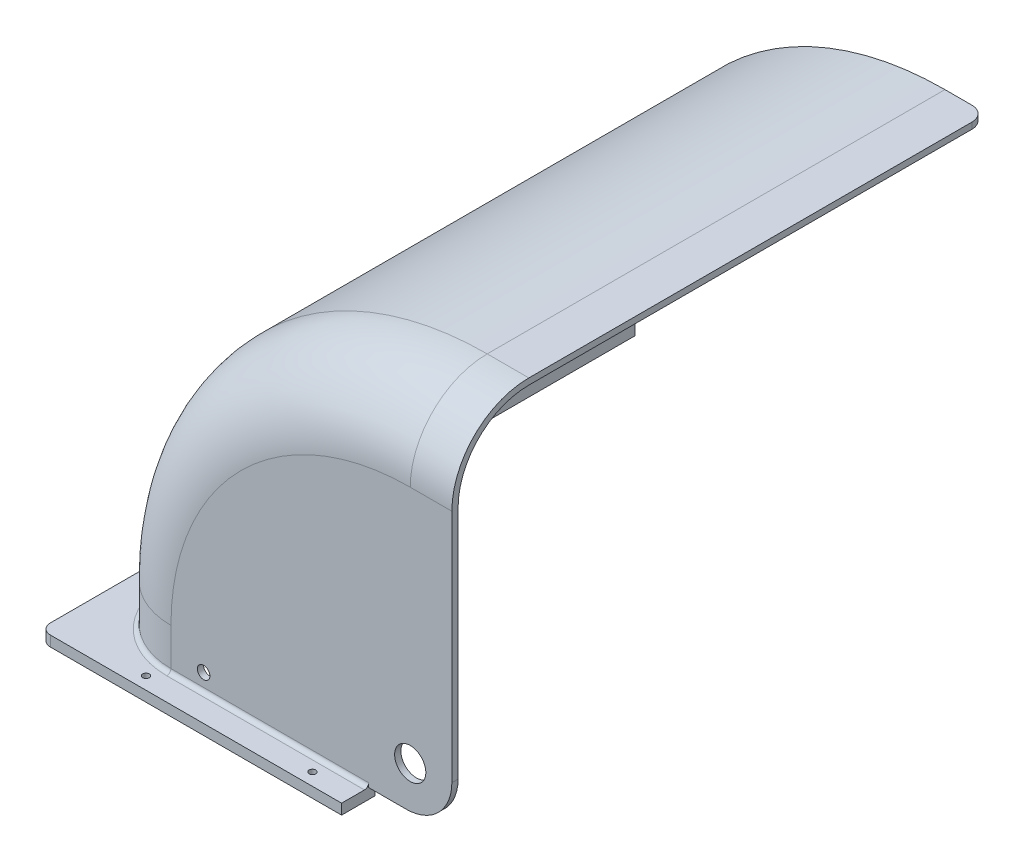
ISO-10303-21;
HEADER;
FILE_DESCRIPTION(('STEP AP214'),'2;1');
FILE_NAME('part.step','',(''),(''),'','','');
FILE_SCHEMA(('AUTOMOTIVE_DESIGN { 1 0 10303 214 1 1 1 1 }'));
ENDSEC;
DATA;
#1=APPLICATION_CONTEXT('core data for automotive mechanical design processes');
#2=APPLICATION_PROTOCOL_DEFINITION('international standard','automotive_design',2000,#1);
#3=PRODUCT_CONTEXT('',#1,'mechanical');
#4=PRODUCT('Part','Part','',(#3));
#5=PRODUCT_RELATED_PRODUCT_CATEGORY('part','',(#4));
#6=PRODUCT_DEFINITION_FORMATION('','',#4);
#7=PRODUCT_DEFINITION_CONTEXT('part definition',#1,'design');
#8=PRODUCT_DEFINITION('design','',#6,#7);
#9=PRODUCT_DEFINITION_SHAPE('','',#8);
#10=(LENGTH_UNIT() NAMED_UNIT(*) SI_UNIT(.MILLI.,.METRE.));
#11=(NAMED_UNIT(*) PLANE_ANGLE_UNIT() SI_UNIT($,.RADIAN.));
#12=(NAMED_UNIT(*) SI_UNIT($,.STERADIAN.) SOLID_ANGLE_UNIT());
#13=UNCERTAINTY_MEASURE_WITH_UNIT(LENGTH_MEASURE(1.E-05),#10,'distance_accuracy_value','');
#14=(GEOMETRIC_REPRESENTATION_CONTEXT(3) GLOBAL_UNCERTAINTY_ASSIGNED_CONTEXT((#13)) GLOBAL_UNIT_ASSIGNED_CONTEXT((#10,
#11,#12)) REPRESENTATION_CONTEXT('',''));
#15=CARTESIAN_POINT('',(0.,0.,0.));
#16=DIRECTION('',(0.,0.,1.));
#17=DIRECTION('',(1.,0.,0.));
#18=AXIS2_PLACEMENT_3D('',#15,#16,#17);
#19=CARTESIAN_POINT('',(0.,5.,0.));
#20=DIRECTION('',(0.,1.,0.));
#21=DIRECTION('',(0.,0.,1.));
#22=AXIS2_PLACEMENT_3D('',#19,#20,#21);
#23=PLANE('',#22);
#24=DIRECTION('',(1.,0.,0.));
#25=VECTOR('',#24,1.);
#26=CARTESIAN_POINT('',(0.,5.,0.));
#27=LINE('',#26,#25);
#28=CARTESIAN_POINT('',(-165.,5.,0.));
#29=VERTEX_POINT('',#28);
#30=CARTESIAN_POINT('',(-154.,5.,0.));
#31=VERTEX_POINT('',#30);
#32=EDGE_CURVE('E568',#29,#31,#27,.T.);
#33=ORIENTED_EDGE('',*,*,#32,.F.);
#34=DIRECTION('',(0.,0.,1.));
#35=VECTOR('',#34,1.);
#36=CARTESIAN_POINT('',(-165.,5.,-270.));
#37=LINE('',#36,#35);
#38=CARTESIAN_POINT('',(-165.,5.,265.));
#39=VERTEX_POINT('',#38);
#40=EDGE_CURVE('E225',#29,#39,#37,.T.);
#41=ORIENTED_EDGE('',*,*,#40,.T.);
#42=CARTESIAN_POINT('',(-160.,5.,265.));
#43=DIRECTION('',(0.,1.,0.));
#44=DIRECTION('',(0.,0.,1.));
#45=AXIS2_PLACEMENT_3D('',#42,#43,#44);
#46=CIRCLE('',#45,5.);
#47=CARTESIAN_POINT('',(-160.,5.,270.));
#48=VERTEX_POINT('',#47);
#49=EDGE_CURVE('E284',#39,#48,#46,.T.);
#50=ORIENTED_EDGE('',*,*,#49,.T.);
#51=DIRECTION('',(1.,0.,0.));
#52=VECTOR('',#51,1.);
#53=CARTESIAN_POINT('',(-165.,5.,270.));
#54=LINE('',#53,#52);
#55=CARTESIAN_POINT('',(-20.,5.,270.));
#56=VERTEX_POINT('',#55);
#57=EDGE_CURVE('E230',#48,#56,#54,.T.);
#58=ORIENTED_EDGE('',*,*,#57,.T.);
#59=DIRECTION('',(0.,0.,1.));
#60=VECTOR('',#59,1.);
#61=CARTESIAN_POINT('',(-20.,5.,-310.311288741493));
#62=LINE('',#61,#60);
#63=CARTESIAN_POINT('',(-20.,5.,259.));
#64=VERTEX_POINT('',#63);
#65=EDGE_CURVE('E361',#64,#56,#62,.T.);
#66=ORIENTED_EDGE('',*,*,#65,.F.);
#67=DIRECTION('',(1.,0.,0.));
#68=VECTOR('',#67,1.);
#69=CARTESIAN_POINT('',(0.,5.,259.));
#70=LINE('',#69,#68);
#71=CARTESIAN_POINT('',(-115.,5.,259.));
#72=VERTEX_POINT('',#71);
#73=EDGE_CURVE('E298',#64,#72,#70,.F.);
#74=ORIENTED_EDGE('',*,*,#73,.T.);
#75=CARTESIAN_POINT('',(-115.,5.,220.));
#76=DIRECTION('',(0.,1.,0.));
#77=DIRECTION('',(0.,0.,1.));
#78=AXIS2_PLACEMENT_3D('',#75,#76,#77);
#79=CIRCLE('',#78,39.);
#80=CARTESIAN_POINT('',(-154.,5.,220.));
#81=VERTEX_POINT('',#80);
#82=EDGE_CURVE('E295',#72,#81,#79,.F.);
#83=ORIENTED_EDGE('',*,*,#82,.T.);
#84=DIRECTION('',(0.,0.,1.));
#85=VECTOR('',#84,1.);
#86=CARTESIAN_POINT('',(-154.,5.,0.));
#87=LINE('',#86,#85);
#88=EDGE_CURVE('E291',#81,#31,#87,.F.);
#89=ORIENTED_EDGE('',*,*,#88,.T.);
#90=EDGE_LOOP('',(#33,#41,#50,#58,#66,#74,#83,#89));
#91=FACE_BOUND('',#90,.T.);
#92=CARTESIAN_POINT('',(-159.,5.,49.9999999999998));
#93=DIRECTION('',(0.,1.,0.));
#94=DIRECTION('',(0.,0.,-1.));
#95=AXIS2_PLACEMENT_3D('',#92,#93,#94);
#96=CIRCLE('',#95,1.59999999999994);
#97=CARTESIAN_POINT('',(-159.,5.,48.3999999999999));
#98=VERTEX_POINT('',#97);
#99=EDGE_CURVE('E462',#98,#98,#96,.T.);
#100=ORIENTED_EDGE('',*,*,#99,.F.);
#101=EDGE_LOOP('',(#100));
#102=FACE_BOUND('',#101,.T.);
#103=CARTESIAN_POINT('',(-120.000000000002,5.,264.));
#104=DIRECTION('',(0.,1.,0.));
#105=DIRECTION('',(0.,0.,-1.));
#106=AXIS2_PLACEMENT_3D('',#103,#104,#105);
#107=CIRCLE('',#106,1.60000000000005);
#108=CARTESIAN_POINT('',(-120.000000000002,5.,262.4));
#109=VERTEX_POINT('',#108);
#110=EDGE_CURVE('E478',#109,#109,#107,.T.);
#111=ORIENTED_EDGE('',*,*,#110,.F.);
#112=EDGE_LOOP('',(#111));
#113=FACE_BOUND('',#112,.T.);
#114=CARTESIAN_POINT('',(-40.0000000000017,5.,264.000000000001));
#115=DIRECTION('',(0.,1.,0.));
#116=DIRECTION('',(0.,0.,-1.));
#117=AXIS2_PLACEMENT_3D('',#114,#115,#116);
#118=CIRCLE('',#117,1.60000000000003);
#119=CARTESIAN_POINT('',(-40.0000000000017,5.,262.400000000001));
#120=VERTEX_POINT('',#119);
#121=EDGE_CURVE('E347',#120,#120,#118,.T.);
#122=ORIENTED_EDGE('',*,*,#121,.F.);
#123=EDGE_LOOP('',(#122));
#124=FACE_BOUND('',#123,.T.);
#125=CARTESIAN_POINT('',(-159.000000000001,5.,210.));
#126=DIRECTION('',(0.,1.,0.));
#127=DIRECTION('',(0.,0.,-1.));
#128=AXIS2_PLACEMENT_3D('',#125,#126,#127);
#129=CIRCLE('',#128,1.59999999999999);
#130=CARTESIAN_POINT('',(-159.000000000001,5.,208.4));
#131=VERTEX_POINT('',#130);
#132=EDGE_CURVE('E470',#131,#131,#129,.T.);
#133=ORIENTED_EDGE('',*,*,#132,.F.);
#134=EDGE_LOOP('',(#133));
#135=FACE_BOUND('',#134,.T.);
#136=CARTESIAN_POINT('',(-159.000000000001,5.,130.));
#137=DIRECTION('',(0.,1.,0.));
#138=DIRECTION('',(0.,0.,-1.));
#139=AXIS2_PLACEMENT_3D('',#136,#137,#138);
#140=CIRCLE('',#139,1.59999999999999);
#141=CARTESIAN_POINT('',(-159.000000000001,5.,128.4));
#142=VERTEX_POINT('',#141);
#143=EDGE_CURVE('E454',#142,#142,#140,.T.);
#144=ORIENTED_EDGE('',*,*,#143,.F.);
#145=EDGE_LOOP('',(#144));
#146=FACE_BOUND('',#145,.T.);
#147=ADVANCED_FACE('F40',(#91,#102,#113,#124,#135,#146),#23,.T.);
#148=CARTESIAN_POINT('',(0.,0.,0.));
#149=DIRECTION('',(0.,1.,0.));
#150=DIRECTION('',(0.,0.,1.));
#151=AXIS2_PLACEMENT_3D('',#148,#149,#150);
#152=PLANE('',#151);
#153=DIRECTION('',(0.,0.,1.));
#154=VECTOR('',#153,1.);
#155=CARTESIAN_POINT('',(-165.,0.,-270.));
#156=LINE('',#155,#154);
#157=CARTESIAN_POINT('',(-165.,0.,0.));
#158=VERTEX_POINT('',#157);
#159=CARTESIAN_POINT('',(-165.,0.,265.));
#160=VERTEX_POINT('',#159);
#161=EDGE_CURVE('E216',#158,#160,#156,.T.);
#162=ORIENTED_EDGE('',*,*,#161,.F.);
#163=DIRECTION('',(-1.,0.,0.));
#164=VECTOR('',#163,1.);
#165=CARTESIAN_POINT('',(20.,0.,0.));
#166=LINE('',#165,#164);
#167=CARTESIAN_POINT('',(-149.,0.,0.));
#168=VERTEX_POINT('',#167);
#169=EDGE_CURVE('E198',#168,#158,#166,.T.);
#170=ORIENTED_EDGE('',*,*,#169,.F.);
#171=DIRECTION('',(0.,0.,-1.));
#172=VECTOR('',#171,1.);
#173=CARTESIAN_POINT('',(-149.,0.,254.));
#174=LINE('',#173,#172);
#175=CARTESIAN_POINT('',(-149.,0.,220.));
#176=VERTEX_POINT('',#175);
#177=EDGE_CURVE('E214',#176,#168,#174,.T.);
#178=ORIENTED_EDGE('',*,*,#177,.F.);
#179=CARTESIAN_POINT('',(-115.,0.,220.));
#180=DIRECTION('',(0.,1.,0.));
#181=DIRECTION('',(0.,0.,1.));
#182=AXIS2_PLACEMENT_3D('',#179,#180,#181);
#183=CIRCLE('',#182,34.);
#184=CARTESIAN_POINT('',(-115.,0.,254.));
#185=VERTEX_POINT('',#184);
#186=EDGE_CURVE('E241',#176,#185,#183,.T.);
#187=ORIENTED_EDGE('',*,*,#186,.T.);
#188=DIRECTION('',(-1.,0.,0.));
#189=VECTOR('',#188,1.);
#190=CARTESIAN_POINT('',(-149.,0.,254.));
#191=LINE('',#190,#189);
#192=CARTESIAN_POINT('',(-20.,0.,254.));
#193=VERTEX_POINT('',#192);
#194=EDGE_CURVE('E226',#193,#185,#191,.T.);
#195=ORIENTED_EDGE('',*,*,#194,.F.);
#196=DIRECTION('',(0.,0.,1.));
#197=VECTOR('',#196,1.);
#198=CARTESIAN_POINT('',(-20.,0.,-310.311288741493));
#199=LINE('',#198,#197);
#200=CARTESIAN_POINT('',(-20.,0.,270.));
#201=VERTEX_POINT('',#200);
#202=EDGE_CURVE('E360',#193,#201,#199,.T.);
#203=ORIENTED_EDGE('',*,*,#202,.T.);
#204=DIRECTION('',(1.,0.,0.));
#205=VECTOR('',#204,1.);
#206=CARTESIAN_POINT('',(-165.,0.,270.));
#207=LINE('',#206,#205);
#208=CARTESIAN_POINT('',(-160.,0.,270.));
#209=VERTEX_POINT('',#208);
#210=EDGE_CURVE('E232',#209,#201,#207,.T.);
#211=ORIENTED_EDGE('',*,*,#210,.F.);
#212=CARTESIAN_POINT('',(-160.,0.,265.));
#213=DIRECTION('',(0.,1.,0.));
#214=DIRECTION('',(0.,0.,1.));
#215=AXIS2_PLACEMENT_3D('',#212,#213,#214);
#216=CIRCLE('',#215,5.);
#217=EDGE_CURVE('E281',#209,#160,#216,.F.);
#218=ORIENTED_EDGE('',*,*,#217,.T.);
#219=EDGE_LOOP('',(#162,#170,#178,#187,#195,#203,#211,#218));
#220=FACE_BOUND('',#219,.T.);
#221=CARTESIAN_POINT('',(-40.0000000000017,0.,264.000000000001));
#222=DIRECTION('',(0.,1.,0.));
#223=DIRECTION('',(0.,0.,-1.));
#224=AXIS2_PLACEMENT_3D('',#221,#222,#223);
#225=CIRCLE('',#224,1.60000000000003);
#226=CARTESIAN_POINT('',(-40.0000000000017,0.,262.400000000001));
#227=VERTEX_POINT('',#226);
#228=EDGE_CURVE('E482',#227,#227,#225,.T.);
#229=ORIENTED_EDGE('',*,*,#228,.T.);
#230=EDGE_LOOP('',(#229));
#231=FACE_BOUND('',#230,.T.);
#232=CARTESIAN_POINT('',(-120.000000000002,0.,264.));
#233=DIRECTION('',(0.,1.,0.));
#234=DIRECTION('',(0.,0.,-1.));
#235=AXIS2_PLACEMENT_3D('',#232,#233,#234);
#236=CIRCLE('',#235,1.60000000000005);
#237=CARTESIAN_POINT('',(-120.000000000002,0.,262.4));
#238=VERTEX_POINT('',#237);
#239=EDGE_CURVE('E474',#238,#238,#236,.T.);
#240=ORIENTED_EDGE('',*,*,#239,.T.);
#241=EDGE_LOOP('',(#240));
#242=FACE_BOUND('',#241,.T.);
#243=CARTESIAN_POINT('',(-159.000000000001,0.,210.));
#244=DIRECTION('',(0.,1.,0.));
#245=DIRECTION('',(0.,0.,-1.));
#246=AXIS2_PLACEMENT_3D('',#243,#244,#245);
#247=CIRCLE('',#246,1.59999999999999);
#248=CARTESIAN_POINT('',(-159.000000000001,0.,208.4));
#249=VERTEX_POINT('',#248);
#250=EDGE_CURVE('E466',#249,#249,#247,.T.);
#251=ORIENTED_EDGE('',*,*,#250,.T.);
#252=EDGE_LOOP('',(#251));
#253=FACE_BOUND('',#252,.T.);
#254=CARTESIAN_POINT('',(-159.,0.,49.9999999999998));
#255=DIRECTION('',(0.,1.,0.));
#256=DIRECTION('',(0.,0.,-1.));
#257=AXIS2_PLACEMENT_3D('',#254,#255,#256);
#258=CIRCLE('',#257,1.59999999999994);
#259=CARTESIAN_POINT('',(-159.,0.,48.3999999999999));
#260=VERTEX_POINT('',#259);
#261=EDGE_CURVE('E458',#260,#260,#258,.T.);
#262=ORIENTED_EDGE('',*,*,#261,.T.);
#263=EDGE_LOOP('',(#262));
#264=FACE_BOUND('',#263,.T.);
#265=CARTESIAN_POINT('',(-159.000000000001,0.,130.));
#266=DIRECTION('',(0.,1.,0.));
#267=DIRECTION('',(0.,0.,-1.));
#268=AXIS2_PLACEMENT_3D('',#265,#266,#267);
#269=CIRCLE('',#268,1.59999999999999);
#270=CARTESIAN_POINT('',(-159.000000000001,0.,128.4));
#271=VERTEX_POINT('',#270);
#272=EDGE_CURVE('E453',#271,#271,#269,.T.);
#273=ORIENTED_EDGE('',*,*,#272,.T.);
#274=EDGE_LOOP('',(#273));
#275=FACE_BOUND('',#274,.T.);
#276=ADVANCED_FACE('F211',(#220,#231,#242,#253,#264,#275),#152,.F.);
#277=CARTESIAN_POINT('',(-165.,5.,-270.));
#278=DIRECTION('',(1.,0.,0.));
#279=DIRECTION('',(0.,0.,-1.));
#280=AXIS2_PLACEMENT_3D('',#277,#278,#279);
#281=PLANE('',#280);
#282=ORIENTED_EDGE('',*,*,#40,.F.);
#283=DIRECTION('',(0.,-1.,0.));
#284=VECTOR('',#283,1.);
#285=CARTESIAN_POINT('',(-165.,5.,0.));
#286=LINE('',#285,#284);
#287=EDGE_CURVE('E573',#29,#158,#286,.T.);
#288=ORIENTED_EDGE('',*,*,#287,.T.);
#289=ORIENTED_EDGE('',*,*,#161,.T.);
#290=DIRECTION('',(0.,-1.,0.));
#291=VECTOR('',#290,1.);
#292=CARTESIAN_POINT('',(-165.,5.,265.));
#293=LINE('',#292,#291);
#294=EDGE_CURVE('E277',#160,#39,#293,.F.);
#295=ORIENTED_EDGE('',*,*,#294,.T.);
#296=EDGE_LOOP('',(#282,#288,#289,#295));
#297=FACE_BOUND('',#296,.T.);
#298=ADVANCED_FACE('F514',(#297),#281,.F.);
#299=CARTESIAN_POINT('',(-165.,5.,270.));
#300=DIRECTION('',(0.,0.,-1.));
#301=DIRECTION('',(-1.,0.,0.));
#302=AXIS2_PLACEMENT_3D('',#299,#300,#301);
#303=PLANE('',#302);
#304=ORIENTED_EDGE('',*,*,#57,.F.);
#305=DIRECTION('',(0.,-1.,0.));
#306=VECTOR('',#305,1.);
#307=CARTESIAN_POINT('',(-160.,5.,270.));
#308=LINE('',#307,#306);
#309=EDGE_CURVE('E287',#48,#209,#308,.T.);
#310=ORIENTED_EDGE('',*,*,#309,.T.);
#311=ORIENTED_EDGE('',*,*,#210,.T.);
#312=DIRECTION('',(0.,-1.,0.));
#313=VECTOR('',#312,1.);
#314=CARTESIAN_POINT('',(-20.,0.,270.));
#315=LINE('',#314,#313);
#316=EDGE_CURVE('E353',#56,#201,#315,.T.);
#317=ORIENTED_EDGE('',*,*,#316,.F.);
#318=EDGE_LOOP('',(#304,#310,#311,#317));
#319=FACE_BOUND('',#318,.T.);
#320=ADVANCED_FACE('F352',(#319),#303,.F.);
#321=CARTESIAN_POINT('',(-149.,5.,254.));
#322=DIRECTION('',(0.,0.,1.));
#323=DIRECTION('',(1.,0.,0.));
#324=AXIS2_PLACEMENT_3D('',#321,#322,#323);
#325=PLANE('',#324);
#326=CARTESIAN_POINT('',(-99.3061123194261,13.2400656463833,254.));
#327=DIRECTION('',(0.,0.,1.));
#328=DIRECTION('',(1.,0.,0.));
#329=AXIS2_PLACEMENT_3D('',#326,#327,#328);
#330=CIRCLE('',#329,3.00000000000001);
#331=CARTESIAN_POINT('',(-96.3061123194261,13.2400656463833,254.));
#332=VERTEX_POINT('',#331);
#333=EDGE_CURVE('E323',#332,#332,#330,.T.);
#334=ORIENTED_EDGE('',*,*,#333,.T.);
#335=EDGE_LOOP('',(#334));
#336=FACE_BOUND('',#335,.T.);
#337=CARTESIAN_POINT('',(0.,25.,254.));
#338=DIRECTION('',(0.,0.,1.));
#339=DIRECTION('',(1.,0.,0.));
#340=AXIS2_PLACEMENT_3D('',#337,#338,#339);
#341=CIRCLE('',#340,7.5);
#342=CARTESIAN_POINT('',(7.5,25.,254.));
#343=VERTEX_POINT('',#342);
#344=EDGE_CURVE('E363',#343,#343,#341,.T.);
#345=ORIENTED_EDGE('',*,*,#344,.T.);
#346=EDGE_LOOP('',(#345));
#347=FACE_BOUND('',#346,.T.);
#348=DIRECTION('',(0.,1.,0.));
#349=VECTOR('',#348,1.);
#350=CARTESIAN_POINT('',(20.,0.,254.));
#351=LINE('',#350,#349);
#352=CARTESIAN_POINT('',(20.,27.,254.));
#353=VERTEX_POINT('',#352);
#354=CARTESIAN_POINT('',(20.,140.,254.));
#355=VERTEX_POINT('',#354);
#356=EDGE_CURVE('E381',#353,#355,#351,.T.);
#357=ORIENTED_EDGE('',*,*,#356,.F.);
#358=CARTESIAN_POINT('',(-2.,27.,254.));
#359=DIRECTION('',(0.,0.,1.));
#360=DIRECTION('',(1.,0.,0.));
#361=AXIS2_PLACEMENT_3D('',#358,#359,#360);
#362=CIRCLE('',#361,22.);
#363=CARTESIAN_POINT('',(-2.,5.,254.));
#364=VERTEX_POINT('',#363);
#365=EDGE_CURVE('E274',#353,#364,#362,.F.);
#366=ORIENTED_EDGE('',*,*,#365,.T.);
#367=DIRECTION('',(-1.,0.,0.));
#368=VECTOR('',#367,1.);
#369=CARTESIAN_POINT('',(-149.,5.,254.));
#370=LINE('',#369,#368);
#371=CARTESIAN_POINT('',(-20.,5.,254.));
#372=VERTEX_POINT('',#371);
#373=EDGE_CURVE('E373',#364,#372,#370,.T.);
#374=ORIENTED_EDGE('',*,*,#373,.T.);
#375=DIRECTION('',(0.,-1.,0.));
#376=VECTOR('',#375,1.);
#377=CARTESIAN_POINT('',(-20.,5.,254.));
#378=LINE('',#377,#376);
#379=EDGE_CURVE('E260',#372,#193,#378,.T.);
#380=ORIENTED_EDGE('',*,*,#379,.T.);
#381=ORIENTED_EDGE('',*,*,#194,.T.);
#382=DIRECTION('',(0.,-1.,0.));
#383=VECTOR('',#382,1.);
#384=CARTESIAN_POINT('',(-115.,25.,254.));
#385=LINE('',#384,#383);
#386=CARTESIAN_POINT('',(-115.,25.,254.));
#387=VERTEX_POINT('',#386);
#388=EDGE_CURVE('E238',#185,#387,#385,.F.);
#389=ORIENTED_EDGE('',*,*,#388,.T.);
#390=CARTESIAN_POINT('',(0.,25.,254.));
#391=DIRECTION('',(0.,0.,1.));
#392=DIRECTION('',(1.,0.,0.));
#393=AXIS2_PLACEMENT_3D('',#390,#391,#392);
#394=CIRCLE('',#393,115.);
#395=CARTESIAN_POINT('',(4.02455846426619E-13,140.,254.));
#396=VERTEX_POINT('',#395);
#397=EDGE_CURVE('E435',#396,#387,#394,.T.);
#398=ORIENTED_EDGE('',*,*,#397,.F.);
#399=DIRECTION('',(-1.,0.,0.));
#400=VECTOR('',#399,1.);
#401=CARTESIAN_POINT('',(20.,140.,254.));
#402=LINE('',#401,#400);
#403=EDGE_CURVE('E412',#355,#396,#402,.T.);
#404=ORIENTED_EDGE('',*,*,#403,.F.);
#405=EDGE_LOOP('',(#357,#366,#374,#380,#381,#389,#398,#404));
#406=FACE_BOUND('',#405,.T.);
#407=ADVANCED_FACE('F506',(#336,#347,#406),#325,.F.);
#408=CARTESIAN_POINT('',(-149.,5.,254.));
#409=DIRECTION('',(-1.,0.,0.));
#410=DIRECTION('',(0.,0.,1.));
#411=AXIS2_PLACEMENT_3D('',#408,#409,#410);
#412=PLANE('',#411);
#413=ORIENTED_EDGE('',*,*,#177,.T.);
#414=DIRECTION('',(0.,1.,0.));
#415=VECTOR('',#414,1.);
#416=CARTESIAN_POINT('',(-149.,5.,0.));
#417=LINE('',#416,#415);
#418=CARTESIAN_POINT('',(-149.,25.,0.));
#419=VERTEX_POINT('',#418);
#420=EDGE_CURVE('E194',#168,#419,#417,.T.);
#421=ORIENTED_EDGE('',*,*,#420,.T.);
#422=DIRECTION('',(0.,0.,-1.));
#423=VECTOR('',#422,1.);
#424=CARTESIAN_POINT('',(-149.,25.,-254.));
#425=LINE('',#424,#423);
#426=CARTESIAN_POINT('',(-149.,25.,220.));
#427=VERTEX_POINT('',#426);
#428=EDGE_CURVE('E450',#427,#419,#425,.T.);
#429=ORIENTED_EDGE('',*,*,#428,.F.);
#430=DIRECTION('',(0.,-1.,0.));
#431=VECTOR('',#430,1.);
#432=CARTESIAN_POINT('',(-149.,0.,220.));
#433=LINE('',#432,#431);
#434=EDGE_CURVE('E223',#427,#176,#433,.T.);
#435=ORIENTED_EDGE('',*,*,#434,.T.);
#436=EDGE_LOOP('',(#413,#421,#429,#435));
#437=FACE_BOUND('',#436,.T.);
#438=ADVANCED_FACE('F221',(#437),#412,.F.);
#439=CARTESIAN_POINT('',(-40.0000000000017,5.,264.000000000001));
#440=DIRECTION('',(0.,-1.,0.));
#441=DIRECTION('',(0.,0.,-1.));
#442=AXIS2_PLACEMENT_3D('',#439,#440,#441);
#443=CYLINDRICAL_SURFACE('',#442,1.60000000000003);
#444=ORIENTED_EDGE('',*,*,#121,.T.);
#445=EDGE_LOOP('',(#444));
#446=FACE_BOUND('',#445,.T.);
#447=ORIENTED_EDGE('',*,*,#228,.F.);
#448=EDGE_LOOP('',(#447));
#449=FACE_BOUND('',#448,.T.);
#450=ADVANCED_FACE('F493',(#446,#449),#443,.F.);
#451=CARTESIAN_POINT('',(-120.000000000002,5.,264.));
#452=DIRECTION('',(0.,-1.,0.));
#453=DIRECTION('',(0.,0.,-1.));
#454=AXIS2_PLACEMENT_3D('',#451,#452,#453);
#455=CYLINDRICAL_SURFACE('',#454,1.60000000000005);
#456=ORIENTED_EDGE('',*,*,#110,.T.);
#457=EDGE_LOOP('',(#456));
#458=FACE_BOUND('',#457,.T.);
#459=ORIENTED_EDGE('',*,*,#239,.F.);
#460=EDGE_LOOP('',(#459));
#461=FACE_BOUND('',#460,.T.);
#462=ADVANCED_FACE('F495',(#458,#461),#455,.F.);
#463=CARTESIAN_POINT('',(-159.000000000001,5.,210.));
#464=DIRECTION('',(0.,-1.,0.));
#465=DIRECTION('',(0.,0.,-1.));
#466=AXIS2_PLACEMENT_3D('',#463,#464,#465);
#467=CYLINDRICAL_SURFACE('',#466,1.59999999999999);
#468=ORIENTED_EDGE('',*,*,#132,.T.);
#469=EDGE_LOOP('',(#468));
#470=FACE_BOUND('',#469,.T.);
#471=ORIENTED_EDGE('',*,*,#250,.F.);
#472=EDGE_LOOP('',(#471));
#473=FACE_BOUND('',#472,.T.);
#474=ADVANCED_FACE('F502',(#470,#473),#467,.F.);
#475=CARTESIAN_POINT('',(-159.,5.,49.9999999999998));
#476=DIRECTION('',(0.,-1.,0.));
#477=DIRECTION('',(0.,0.,-1.));
#478=AXIS2_PLACEMENT_3D('',#475,#476,#477);
#479=CYLINDRICAL_SURFACE('',#478,1.59999999999994);
#480=ORIENTED_EDGE('',*,*,#99,.T.);
#481=EDGE_LOOP('',(#480));
#482=FACE_BOUND('',#481,.T.);
#483=ORIENTED_EDGE('',*,*,#261,.F.);
#484=EDGE_LOOP('',(#483));
#485=FACE_BOUND('',#484,.T.);
#486=ADVANCED_FACE('F661',(#482,#485),#479,.F.);
#487=CARTESIAN_POINT('',(-159.000000000001,5.,130.));
#488=DIRECTION('',(0.,-1.,0.));
#489=DIRECTION('',(0.,0.,-1.));
#490=AXIS2_PLACEMENT_3D('',#487,#488,#489);
#491=CYLINDRICAL_SURFACE('',#490,1.59999999999999);
#492=ORIENTED_EDGE('',*,*,#143,.T.);
#493=EDGE_LOOP('',(#492));
#494=FACE_BOUND('',#493,.T.);
#495=ORIENTED_EDGE('',*,*,#272,.F.);
#496=EDGE_LOOP('',(#495));
#497=FACE_BOUND('',#496,.T.);
#498=ADVANCED_FACE('F657',(#494,#497),#491,.F.);
#499=CARTESIAN_POINT('',(-152.,25.,-257.));
#500=DIRECTION('',(1.,0.,0.));
#501=DIRECTION('',(0.,0.,-1.));
#502=AXIS2_PLACEMENT_3D('',#499,#500,#501);
#503=PLANE('',#502);
#504=DIRECTION('',(0.,0.,1.));
#505=VECTOR('',#504,1.);
#506=CARTESIAN_POINT('',(-152.,25.,-257.));
#507=LINE('',#506,#505);
#508=CARTESIAN_POINT('',(-152.,25.,0.));
#509=VERTEX_POINT('',#508);
#510=CARTESIAN_POINT('',(-152.,25.,220.));
#511=VERTEX_POINT('',#510);
#512=EDGE_CURVE('E447',#509,#511,#507,.T.);
#513=ORIENTED_EDGE('',*,*,#512,.F.);
#514=DIRECTION('',(0.,-1.,0.));
#515=VECTOR('',#514,1.);
#516=CARTESIAN_POINT('',(-152.,25.,0.));
#517=LINE('',#516,#515);
#518=CARTESIAN_POINT('',(-152.,7.,0.));
#519=VERTEX_POINT('',#518);
#520=EDGE_CURVE('E218',#509,#519,#517,.T.);
#521=ORIENTED_EDGE('',*,*,#520,.T.);
#522=DIRECTION('',(0.,0.,1.));
#523=VECTOR('',#522,1.);
#524=CARTESIAN_POINT('',(-152.,7.,-257.));
#525=LINE('',#524,#523);
#526=CARTESIAN_POINT('',(-152.,7.,220.));
#527=VERTEX_POINT('',#526);
#528=EDGE_CURVE('E311',#519,#527,#525,.T.);
#529=ORIENTED_EDGE('',*,*,#528,.T.);
#530=DIRECTION('',(0.,-1.,0.));
#531=VECTOR('',#530,1.);
#532=CARTESIAN_POINT('',(-152.,25.,220.));
#533=LINE('',#532,#531);
#534=EDGE_CURVE('E248',#527,#511,#533,.F.);
#535=ORIENTED_EDGE('',*,*,#534,.T.);
#536=EDGE_LOOP('',(#513,#521,#529,#535));
#537=FACE_BOUND('',#536,.T.);
#538=ADVANCED_FACE('F653',(#537),#503,.F.);
#539=CARTESIAN_POINT('',(0.,25.,257.));
#540=DIRECTION('',(0.,0.,-1.));
#541=DIRECTION('',(-1.,0.,0.));
#542=AXIS2_PLACEMENT_3D('',#539,#540,#541);
#543=PLANE('',#542);
#544=CARTESIAN_POINT('',(-99.3061123194261,13.2400656463833,257.));
#545=DIRECTION('',(0.,0.,-1.));
#546=DIRECTION('',(-1.,0.,0.));
#547=AXIS2_PLACEMENT_3D('',#544,#545,#546);
#548=CIRCLE('',#547,3.00000000000001);
#549=CARTESIAN_POINT('',(-102.306112319426,13.2400656463833,257.));
#550=VERTEX_POINT('',#549);
#551=EDGE_CURVE('E206',#550,#550,#548,.F.);
#552=ORIENTED_EDGE('',*,*,#551,.F.);
#553=EDGE_LOOP('',(#552));
#554=FACE_BOUND('',#553,.T.);
#555=CARTESIAN_POINT('',(0.,25.,257.));
#556=DIRECTION('',(0.,0.,1.));
#557=DIRECTION('',(1.,0.,0.));
#558=AXIS2_PLACEMENT_3D('',#555,#556,#557);
#559=CIRCLE('',#558,7.5);
#560=CARTESIAN_POINT('',(7.5,25.,257.));
#561=VERTEX_POINT('',#560);
#562=EDGE_CURVE('E327',#561,#561,#559,.T.);
#563=ORIENTED_EDGE('',*,*,#562,.F.);
#564=EDGE_LOOP('',(#563));
#565=FACE_BOUND('',#564,.T.);
#566=DIRECTION('',(0.,-1.,0.));
#567=VECTOR('',#566,1.);
#568=CARTESIAN_POINT('',(-115.,25.,257.));
#569=LINE('',#568,#567);
#570=CARTESIAN_POINT('',(-115.,25.,257.));
#571=VERTEX_POINT('',#570);
#572=CARTESIAN_POINT('',(-115.,7.,257.));
#573=VERTEX_POINT('',#572);
#574=EDGE_CURVE('E256',#571,#573,#569,.T.);
#575=ORIENTED_EDGE('',*,*,#574,.T.);
#576=DIRECTION('',(1.,0.,0.));
#577=VECTOR('',#576,1.);
#578=CARTESIAN_POINT('',(0.,7.,257.));
#579=LINE('',#578,#577);
#580=CARTESIAN_POINT('',(-20.,7.,257.));
#581=VERTEX_POINT('',#580);
#582=EDGE_CURVE('E304',#573,#581,#579,.T.);
#583=ORIENTED_EDGE('',*,*,#582,.T.);
#584=DIRECTION('',(0.,-1.,0.));
#585=VECTOR('',#584,1.);
#586=CARTESIAN_POINT('',(-20.,0.,257.));
#587=LINE('',#586,#585);
#588=CARTESIAN_POINT('',(-20.,5.,257.));
#589=VERTEX_POINT('',#588);
#590=EDGE_CURVE('E301',#581,#589,#587,.T.);
#591=ORIENTED_EDGE('',*,*,#590,.T.);
#592=DIRECTION('',(1.,0.,0.));
#593=VECTOR('',#592,1.);
#594=CARTESIAN_POINT('',(0.,5.,257.));
#595=LINE('',#594,#593);
#596=CARTESIAN_POINT('',(-2.,5.,257.));
#597=VERTEX_POINT('',#596);
#598=EDGE_CURVE('E367',#589,#597,#595,.T.);
#599=ORIENTED_EDGE('',*,*,#598,.T.);
#600=CARTESIAN_POINT('',(-2.,27.,257.));
#601=DIRECTION('',(0.,0.,-1.));
#602=DIRECTION('',(-1.,0.,0.));
#603=AXIS2_PLACEMENT_3D('',#600,#601,#602);
#604=CIRCLE('',#603,22.);
#605=CARTESIAN_POINT('',(20.,27.,257.));
#606=VERTEX_POINT('',#605);
#607=EDGE_CURVE('E268',#597,#606,#604,.F.);
#608=ORIENTED_EDGE('',*,*,#607,.T.);
#609=DIRECTION('',(0.,-1.,0.));
#610=VECTOR('',#609,1.);
#611=CARTESIAN_POINT('',(20.,5.,257.));
#612=LINE('',#611,#610);
#613=CARTESIAN_POINT('',(20.,140.,257.));
#614=VERTEX_POINT('',#613);
#615=EDGE_CURVE('E396',#614,#606,#612,.T.);
#616=ORIENTED_EDGE('',*,*,#615,.F.);
#617=DIRECTION('',(-1.,0.,0.));
#618=VECTOR('',#617,1.);
#619=CARTESIAN_POINT('',(20.,140.,257.));
#620=LINE('',#619,#618);
#621=CARTESIAN_POINT('',(4.02455846426619E-13,140.,257.));
#622=VERTEX_POINT('',#621);
#623=EDGE_CURVE('E400',#614,#622,#620,.T.);
#624=ORIENTED_EDGE('',*,*,#623,.T.);
#625=CARTESIAN_POINT('',(0.,25.,257.));
#626=DIRECTION('',(0.,0.,1.));
#627=DIRECTION('',(1.,0.,0.));
#628=AXIS2_PLACEMENT_3D('',#625,#626,#627);
#629=CIRCLE('',#628,115.);
#630=EDGE_CURVE('E439',#622,#571,#629,.T.);
#631=ORIENTED_EDGE('',*,*,#630,.T.);
#632=EDGE_LOOP('',(#575,#583,#591,#599,#608,#616,#624,#631));
#633=FACE_BOUND('',#632,.T.);
#634=ADVANCED_FACE('F531',(#554,#565,#633),#543,.F.);
#635=CARTESIAN_POINT('',(-115.,5.,220.));
#636=DIRECTION('',(0.,1.,0.));
#637=DIRECTION('',(0.,0.,1.));
#638=AXIS2_PLACEMENT_3D('',#635,#636,#637);
#639=CYLINDRICAL_SURFACE('',#638,34.);
#640=CARTESIAN_POINT('',(-115.,25.,220.));
#641=DIRECTION('',(0.,-1.,0.));
#642=DIRECTION('',(0.,0.,-1.));
#643=AXIS2_PLACEMENT_3D('',#640,#641,#642);
#644=CIRCLE('',#643,34.);
#645=EDGE_CURVE('E244',#387,#427,#644,.T.);
#646=ORIENTED_EDGE('',*,*,#645,.F.);
#647=ORIENTED_EDGE('',*,*,#388,.F.);
#648=ORIENTED_EDGE('',*,*,#186,.F.);
#649=ORIENTED_EDGE('',*,*,#434,.F.);
#650=EDGE_LOOP('',(#646,#647,#648,#649));
#651=FACE_BOUND('',#650,.T.);
#652=ADVANCED_FACE('F527',(#651),#639,.F.);
#653=CARTESIAN_POINT('',(-115.,25.,220.));
#654=DIRECTION('',(0.,-1.,0.));
#655=DIRECTION('',(0.,0.,-1.));
#656=AXIS2_PLACEMENT_3D('',#653,#654,#655);
#657=CYLINDRICAL_SURFACE('',#656,37.);
#658=ORIENTED_EDGE('',*,*,#534,.F.);
#659=CARTESIAN_POINT('',(-115.,7.,220.));
#660=DIRECTION('',(0.,1.,0.));
#661=DIRECTION('',(0.,0.,1.));
#662=AXIS2_PLACEMENT_3D('',#659,#660,#661);
#663=CIRCLE('',#662,37.);
#664=EDGE_CURVE('E308',#527,#573,#663,.T.);
#665=ORIENTED_EDGE('',*,*,#664,.T.);
#666=ORIENTED_EDGE('',*,*,#574,.F.);
#667=CARTESIAN_POINT('',(-115.,25.,220.));
#668=DIRECTION('',(0.,-1.,0.));
#669=DIRECTION('',(0.,0.,-1.));
#670=AXIS2_PLACEMENT_3D('',#667,#668,#669);
#671=CIRCLE('',#670,37.);
#672=EDGE_CURVE('E252',#511,#571,#671,.F.);
#673=ORIENTED_EDGE('',*,*,#672,.F.);
#674=EDGE_LOOP('',(#658,#665,#666,#673));
#675=FACE_BOUND('',#674,.T.);
#676=ADVANCED_FACE('F530',(#675),#657,.T.);
#677=CARTESIAN_POINT('',(0.,25.,-257.));
#678=DIRECTION('',(0.,0.,1.));
#679=DIRECTION('',(1.,0.,0.));
#680=AXIS2_PLACEMENT_3D('',#677,#678,#679);
#681=CYLINDRICAL_SURFACE('',#680,152.);
#682=DIRECTION('',(0.,0.,1.));
#683=VECTOR('',#682,1.);
#684=CARTESIAN_POINT('',(5.30825383648903E-13,177.,-220.));
#685=LINE('',#684,#683);
#686=CARTESIAN_POINT('',(5.30825383648903E-13,177.,0.));
#687=VERTEX_POINT('',#686);
#688=CARTESIAN_POINT('',(5.30825383648903E-13,177.,220.));
#689=VERTEX_POINT('',#688);
#690=EDGE_CURVE('E416',#687,#689,#685,.T.);
#691=ORIENTED_EDGE('',*,*,#690,.F.);
#692=CARTESIAN_POINT('',(0.,25.,0.));
#693=DIRECTION('',(0.,0.,1.));
#694=DIRECTION('',(1.,0.,0.));
#695=AXIS2_PLACEMENT_3D('',#692,#693,#694);
#696=CIRCLE('',#695,152.);
#697=EDGE_CURVE('E571',#687,#509,#696,.T.);
#698=ORIENTED_EDGE('',*,*,#697,.T.);
#699=ORIENTED_EDGE('',*,*,#512,.T.);
#700=CARTESIAN_POINT('',(0.,25.,220.));
#701=DIRECTION('',(0.,0.,1.));
#702=DIRECTION('',(1.,0.,0.));
#703=AXIS2_PLACEMENT_3D('',#700,#701,#702);
#704=CIRCLE('',#703,152.);
#705=EDGE_CURVE('E443',#689,#511,#704,.T.);
#706=ORIENTED_EDGE('',*,*,#705,.F.);
#707=EDGE_LOOP('',(#691,#698,#699,#706));
#708=FACE_BOUND('',#707,.T.);
#709=ADVANCED_FACE('F535',(#708),#681,.T.);
#710=CARTESIAN_POINT('',(0.,25.,220.));
#711=DIRECTION('',(0.,0.,1.));
#712=DIRECTION('',(1.,0.,0.));
#713=AXIS2_PLACEMENT_3D('',#710,#711,#712);
#714=TOROIDAL_SURFACE('',#713,115.,37.);
#715=ORIENTED_EDGE('',*,*,#630,.F.);
#716=CARTESIAN_POINT('',(4.02455846426619E-13,140.,220.));
#717=DIRECTION('',(1.,0.,0.));
#718=DIRECTION('',(0.,0.,-1.));
#719=AXIS2_PLACEMENT_3D('',#716,#717,#718);
#720=CIRCLE('',#719,37.);
#721=EDGE_CURVE('E419',#689,#622,#720,.T.);
#722=ORIENTED_EDGE('',*,*,#721,.F.);
#723=ORIENTED_EDGE('',*,*,#705,.T.);
#724=ORIENTED_EDGE('',*,*,#672,.T.);
#725=EDGE_LOOP('',(#715,#722,#723,#724));
#726=FACE_BOUND('',#725,.T.);
#727=ADVANCED_FACE('F643',(#726),#714,.T.);
#728=CARTESIAN_POINT('',(0.,25.,220.));
#729=DIRECTION('',(0.,0.,1.));
#730=DIRECTION('',(1.,0.,0.));
#731=AXIS2_PLACEMENT_3D('',#728,#729,#730);
#732=TOROIDAL_SURFACE('',#731,115.,34.);
#733=CARTESIAN_POINT('',(0.,25.,220.));
#734=DIRECTION('',(0.,0.,1.));
#735=DIRECTION('',(1.,0.,0.));
#736=AXIS2_PLACEMENT_3D('',#733,#734,#735);
#737=CIRCLE('',#736,149.);
#738=CARTESIAN_POINT('',(5.20417042793042E-13,174.,220.));
#739=VERTEX_POINT('',#738);
#740=EDGE_CURVE('E431',#739,#427,#737,.T.);
#741=ORIENTED_EDGE('',*,*,#740,.F.);
#742=CARTESIAN_POINT('',(4.02455846426619E-13,140.,220.));
#743=DIRECTION('',(-1.,0.,0.));
#744=DIRECTION('',(0.,0.,-1.));
#745=AXIS2_PLACEMENT_3D('',#742,#743,#744);
#746=CIRCLE('',#745,34.);
#747=EDGE_CURVE('E423',#396,#739,#746,.T.);
#748=ORIENTED_EDGE('',*,*,#747,.F.);
#749=ORIENTED_EDGE('',*,*,#397,.T.);
#750=ORIENTED_EDGE('',*,*,#645,.T.);
#751=EDGE_LOOP('',(#741,#748,#749,#750));
#752=FACE_BOUND('',#751,.T.);
#753=ADVANCED_FACE('F639',(#752),#732,.F.);
#754=CARTESIAN_POINT('',(0.,25.,-257.));
#755=DIRECTION('',(0.,0.,1.));
#756=DIRECTION('',(1.,0.,0.));
#757=AXIS2_PLACEMENT_3D('',#754,#755,#756);
#758=CYLINDRICAL_SURFACE('',#757,149.);
#759=ORIENTED_EDGE('',*,*,#428,.T.);
#760=CARTESIAN_POINT('',(0.,25.,0.));
#761=DIRECTION('',(0.,0.,1.));
#762=DIRECTION('',(1.,0.,0.));
#763=AXIS2_PLACEMENT_3D('',#760,#761,#762);
#764=CIRCLE('',#763,149.);
#765=CARTESIAN_POINT('',(5.20417042793042E-13,174.,0.));
#766=VERTEX_POINT('',#765);
#767=EDGE_CURVE('E201',#419,#766,#764,.F.);
#768=ORIENTED_EDGE('',*,*,#767,.T.);
#769=DIRECTION('',(0.,0.,-1.));
#770=VECTOR('',#769,1.);
#771=CARTESIAN_POINT('',(5.20417042793042E-13,174.,-220.));
#772=LINE('',#771,#770);
#773=EDGE_CURVE('E427',#739,#766,#772,.T.);
#774=ORIENTED_EDGE('',*,*,#773,.F.);
#775=ORIENTED_EDGE('',*,*,#740,.T.);
#776=EDGE_LOOP('',(#759,#768,#774,#775));
#777=FACE_BOUND('',#776,.T.);
#778=ADVANCED_FACE('F635',(#777),#758,.F.);
#779=CARTESIAN_POINT('',(20.,140.,220.));
#780=DIRECTION('',(-1.,0.,0.));
#781=DIRECTION('',(0.,0.,1.));
#782=AXIS2_PLACEMENT_3D('',#779,#780,#781);
#783=CYLINDRICAL_SURFACE('',#782,34.);
#784=ORIENTED_EDGE('',*,*,#747,.T.);
#785=DIRECTION('',(-1.,0.,0.));
#786=VECTOR('',#785,1.);
#787=CARTESIAN_POINT('',(20.,174.,220.));
#788=LINE('',#787,#786);
#789=CARTESIAN_POINT('',(20.,174.,220.));
#790=VERTEX_POINT('',#789);
#791=EDGE_CURVE('E408',#790,#739,#788,.T.);
#792=ORIENTED_EDGE('',*,*,#791,.F.);
#793=CARTESIAN_POINT('',(20.,140.,220.));
#794=DIRECTION('',(-1.,0.,0.));
#795=DIRECTION('',(0.,0.,-1.));
#796=AXIS2_PLACEMENT_3D('',#793,#794,#795);
#797=CIRCLE('',#796,34.);
#798=EDGE_CURVE('E384',#355,#790,#797,.T.);
#799=ORIENTED_EDGE('',*,*,#798,.F.);
#800=ORIENTED_EDGE('',*,*,#403,.T.);
#801=EDGE_LOOP('',(#784,#792,#799,#800));
#802=FACE_BOUND('',#801,.T.);
#803=ADVANCED_FACE('F632',(#802),#783,.F.);
#804=CARTESIAN_POINT('',(20.,174.,220.));
#805=DIRECTION('',(0.,1.,0.));
#806=DIRECTION('',(0.,0.,1.));
#807=AXIS2_PLACEMENT_3D('',#804,#805,#806);
#808=PLANE('',#807);
#809=DIRECTION('',(1.,0.,0.));
#810=VECTOR('',#809,1.);
#811=CARTESIAN_POINT('',(20.,174.,0.));
#812=LINE('',#811,#810);
#813=CARTESIAN_POINT('',(13.,174.,0.));
#814=VERTEX_POINT('',#813);
#815=EDGE_CURVE('E581',#766,#814,#812,.T.);
#816=ORIENTED_EDGE('',*,*,#815,.T.);
#817=CARTESIAN_POINT('',(13.,174.,7.00000000000003));
#818=DIRECTION('',(0.,1.,0.));
#819=DIRECTION('',(0.,0.,1.));
#820=AXIS2_PLACEMENT_3D('',#817,#818,#819);
#821=CIRCLE('',#820,7.);
#822=CARTESIAN_POINT('',(20.,174.,7.00000000000009));
#823=VERTEX_POINT('',#822);
#824=EDGE_CURVE('E63',#814,#823,#821,.F.);
#825=ORIENTED_EDGE('',*,*,#824,.T.);
#826=DIRECTION('',(0.,0.,-1.));
#827=VECTOR('',#826,1.);
#828=CARTESIAN_POINT('',(20.,174.,220.));
#829=LINE('',#828,#827);
#830=EDGE_CURVE('E387',#790,#823,#829,.T.);
#831=ORIENTED_EDGE('',*,*,#830,.F.);
#832=ORIENTED_EDGE('',*,*,#791,.T.);
#833=ORIENTED_EDGE('',*,*,#773,.T.);
#834=EDGE_LOOP('',(#816,#825,#831,#832,#833));
#835=FACE_BOUND('',#834,.T.);
#836=ADVANCED_FACE('F628',(#835),#808,.F.);
#837=CARTESIAN_POINT('',(20.,177.,220.));
#838=DIRECTION('',(0.,-1.,0.));
#839=DIRECTION('',(0.,0.,-1.));
#840=AXIS2_PLACEMENT_3D('',#837,#838,#839);
#841=PLANE('',#840);
#842=DIRECTION('',(0.,0.,1.));
#843=VECTOR('',#842,1.);
#844=CARTESIAN_POINT('',(20.,177.,220.));
#845=LINE('',#844,#843);
#846=CARTESIAN_POINT('',(20.,177.,7.00000000000009));
#847=VERTEX_POINT('',#846);
#848=CARTESIAN_POINT('',(20.,177.,220.));
#849=VERTEX_POINT('',#848);
#850=EDGE_CURVE('E390',#847,#849,#845,.T.);
#851=ORIENTED_EDGE('',*,*,#850,.F.);
#852=CARTESIAN_POINT('',(13.,177.,7.00000000000003));
#853=DIRECTION('',(0.,-1.,0.));
#854=DIRECTION('',(0.,0.,-1.));
#855=AXIS2_PLACEMENT_3D('',#852,#853,#854);
#856=CIRCLE('',#855,7.);
#857=CARTESIAN_POINT('',(13.,177.,0.));
#858=VERTEX_POINT('',#857);
#859=EDGE_CURVE('E11',#847,#858,#856,.F.);
#860=ORIENTED_EDGE('',*,*,#859,.T.);
#861=DIRECTION('',(-1.,0.,0.));
#862=VECTOR('',#861,1.);
#863=CARTESIAN_POINT('',(20.,177.,0.));
#864=LINE('',#863,#862);
#865=EDGE_CURVE('E577',#858,#687,#864,.T.);
#866=ORIENTED_EDGE('',*,*,#865,.T.);
#867=ORIENTED_EDGE('',*,*,#690,.T.);
#868=DIRECTION('',(-1.,0.,0.));
#869=VECTOR('',#868,1.);
#870=CARTESIAN_POINT('',(20.,177.,220.));
#871=LINE('',#870,#869);
#872=EDGE_CURVE('E404',#849,#689,#871,.T.);
#873=ORIENTED_EDGE('',*,*,#872,.F.);
#874=EDGE_LOOP('',(#851,#860,#866,#867,#873));
#875=FACE_BOUND('',#874,.T.);
#876=ADVANCED_FACE('F624',(#875),#841,.F.);
#877=CARTESIAN_POINT('',(20.,140.,220.));
#878=DIRECTION('',(-1.,0.,0.));
#879=DIRECTION('',(0.,0.,1.));
#880=AXIS2_PLACEMENT_3D('',#877,#878,#879);
#881=CYLINDRICAL_SURFACE('',#880,37.);
#882=ORIENTED_EDGE('',*,*,#721,.T.);
#883=ORIENTED_EDGE('',*,*,#623,.F.);
#884=CARTESIAN_POINT('',(20.,140.,220.));
#885=DIRECTION('',(1.,0.,0.));
#886=DIRECTION('',(0.,0.,-1.));
#887=AXIS2_PLACEMENT_3D('',#884,#885,#886);
#888=CIRCLE('',#887,37.);
#889=EDGE_CURVE('E393',#849,#614,#888,.T.);
#890=ORIENTED_EDGE('',*,*,#889,.F.);
#891=ORIENTED_EDGE('',*,*,#872,.T.);
#892=EDGE_LOOP('',(#882,#883,#890,#891));
#893=FACE_BOUND('',#892,.T.);
#894=ADVANCED_FACE('F621',(#893),#881,.T.);
#895=CARTESIAN_POINT('',(20.,140.,220.));
#896=DIRECTION('',(1.,0.,0.));
#897=DIRECTION('',(0.,0.,-1.));
#898=AXIS2_PLACEMENT_3D('',#895,#896,#897);
#899=PLANE('',#898);
#900=ORIENTED_EDGE('',*,*,#830,.T.);
#901=DIRECTION('',(0.,-1.,0.));
#902=VECTOR('',#901,1.);
#903=CARTESIAN_POINT('',(20.,177.,7.00000000000003));
#904=LINE('',#903,#902);
#905=EDGE_CURVE('E49',#823,#847,#904,.F.);
#906=ORIENTED_EDGE('',*,*,#905,.T.);
#907=ORIENTED_EDGE('',*,*,#850,.T.);
#908=ORIENTED_EDGE('',*,*,#889,.T.);
#909=ORIENTED_EDGE('',*,*,#615,.T.);
#910=DIRECTION('',(0.,0.,1.));
#911=VECTOR('',#910,1.);
#912=CARTESIAN_POINT('',(20.,27.,254.));
#913=LINE('',#912,#911);
#914=EDGE_CURVE('E271',#606,#353,#913,.F.);
#915=ORIENTED_EDGE('',*,*,#914,.T.);
#916=ORIENTED_EDGE('',*,*,#356,.T.);
#917=ORIENTED_EDGE('',*,*,#798,.T.);
#918=EDGE_LOOP('',(#900,#906,#907,#908,#909,#915,#916,#917));
#919=FACE_BOUND('',#918,.T.);
#920=ADVANCED_FACE('F617',(#919),#899,.T.);
#921=CARTESIAN_POINT('',(20.,5.,-310.311288741493));
#922=DIRECTION('',(0.,1.,0.));
#923=DIRECTION('',(0.,0.,1.));
#924=AXIS2_PLACEMENT_3D('',#921,#922,#923);
#925=PLANE('',#924);
#926=ORIENTED_EDGE('',*,*,#373,.F.);
#927=DIRECTION('',(0.,0.,1.));
#928=VECTOR('',#927,1.);
#929=CARTESIAN_POINT('',(-2.,5.,257.));
#930=LINE('',#929,#928);
#931=EDGE_CURVE('E264',#364,#597,#930,.T.);
#932=ORIENTED_EDGE('',*,*,#931,.T.);
#933=ORIENTED_EDGE('',*,*,#598,.F.);
#934=EDGE_CURVE('E368',#372,#589,#62,.T.);
#935=ORIENTED_EDGE('',*,*,#934,.F.);
#936=EDGE_LOOP('',(#926,#932,#933,#935));
#937=FACE_BOUND('',#936,.T.);
#938=ADVANCED_FACE('F614',(#937),#925,.F.);
#939=CARTESIAN_POINT('',(-20.,0.,-310.311288741493));
#940=DIRECTION('',(-1.,0.,0.));
#941=DIRECTION('',(0.,0.,1.));
#942=AXIS2_PLACEMENT_3D('',#939,#940,#941);
#943=PLANE('',#942);
#944=ORIENTED_EDGE('',*,*,#934,.T.);
#945=ORIENTED_EDGE('',*,*,#590,.F.);
#946=CARTESIAN_POINT('',(-20.,7.,259.));
#947=DIRECTION('',(-1.,0.,0.));
#948=DIRECTION('',(0.,0.,1.));
#949=AXIS2_PLACEMENT_3D('',#946,#947,#948);
#950=CIRCLE('',#949,2.);
#951=EDGE_CURVE('E314',#581,#64,#950,.T.);
#952=ORIENTED_EDGE('',*,*,#951,.T.);
#953=ORIENTED_EDGE('',*,*,#65,.T.);
#954=ORIENTED_EDGE('',*,*,#316,.T.);
#955=ORIENTED_EDGE('',*,*,#202,.F.);
#956=ORIENTED_EDGE('',*,*,#379,.F.);
#957=EDGE_LOOP('',(#944,#945,#952,#953,#954,#955,#956));
#958=FACE_BOUND('',#957,.T.);
#959=ADVANCED_FACE('F358',(#958),#943,.F.);
#960=CARTESIAN_POINT('',(-2.,27.,-310.311288741493));
#961=DIRECTION('',(0.,0.,-1.));
#962=DIRECTION('',(-1.,0.,0.));
#963=AXIS2_PLACEMENT_3D('',#960,#961,#962);
#964=CYLINDRICAL_SURFACE('',#963,22.);
#965=ORIENTED_EDGE('',*,*,#365,.F.);
#966=ORIENTED_EDGE('',*,*,#914,.F.);
#967=ORIENTED_EDGE('',*,*,#607,.F.);
#968=ORIENTED_EDGE('',*,*,#931,.F.);
#969=EDGE_LOOP('',(#965,#966,#967,#968));
#970=FACE_BOUND('',#969,.T.);
#971=ADVANCED_FACE('F537',(#970),#964,.T.);
#972=CARTESIAN_POINT('',(0.,25.,-278.213203435597));
#973=DIRECTION('',(0.,0.,1.));
#974=DIRECTION('',(1.,0.,0.));
#975=AXIS2_PLACEMENT_3D('',#972,#973,#974);
#976=CYLINDRICAL_SURFACE('',#975,7.5);
#977=ORIENTED_EDGE('',*,*,#562,.T.);
#978=EDGE_LOOP('',(#977));
#979=FACE_BOUND('',#978,.T.);
#980=ORIENTED_EDGE('',*,*,#344,.F.);
#981=EDGE_LOOP('',(#980));
#982=FACE_BOUND('',#981,.T.);
#983=ADVANCED_FACE('F540',(#979,#982),#976,.F.);
#984=CARTESIAN_POINT('',(-160.,5.,265.));
#985=DIRECTION('',(0.,-1.,0.));
#986=DIRECTION('',(0.,0.,-1.));
#987=AXIS2_PLACEMENT_3D('',#984,#985,#986);
#988=CYLINDRICAL_SURFACE('',#987,5.);
#989=ORIENTED_EDGE('',*,*,#49,.F.);
#990=ORIENTED_EDGE('',*,*,#294,.F.);
#991=ORIENTED_EDGE('',*,*,#217,.F.);
#992=ORIENTED_EDGE('',*,*,#309,.F.);
#993=EDGE_LOOP('',(#989,#990,#991,#992));
#994=FACE_BOUND('',#993,.T.);
#995=ADVANCED_FACE('F542',(#994),#988,.T.);
#996=CARTESIAN_POINT('',(0.,7.,259.));
#997=DIRECTION('',(1.,0.,0.));
#998=DIRECTION('',(0.,0.,-1.));
#999=AXIS2_PLACEMENT_3D('',#996,#997,#998);
#1000=CYLINDRICAL_SURFACE('',#999,2.);
#1001=ORIENTED_EDGE('',*,*,#951,.F.);
#1002=ORIENTED_EDGE('',*,*,#582,.F.);
#1003=CARTESIAN_POINT('',(-115.,7.,259.));
#1004=DIRECTION('',(1.,0.,0.));
#1005=DIRECTION('',(0.,0.,-1.));
#1006=AXIS2_PLACEMENT_3D('',#1003,#1004,#1005);
#1007=CIRCLE('',#1006,2.);
#1008=EDGE_CURVE('E322',#72,#573,#1007,.T.);
#1009=ORIENTED_EDGE('',*,*,#1008,.F.);
#1010=ORIENTED_EDGE('',*,*,#73,.F.);
#1011=EDGE_LOOP('',(#1001,#1002,#1009,#1010));
#1012=FACE_BOUND('',#1011,.T.);
#1013=ADVANCED_FACE('F545',(#1012),#1000,.F.);
#1014=CARTESIAN_POINT('',(-115.,7.,220.));
#1015=DIRECTION('',(0.,1.,0.));
#1016=DIRECTION('',(0.,0.,1.));
#1017=AXIS2_PLACEMENT_3D('',#1014,#1015,#1016);
#1018=TOROIDAL_SURFACE('',#1017,39.,2.);
#1019=ORIENTED_EDGE('',*,*,#1008,.T.);
#1020=ORIENTED_EDGE('',*,*,#664,.F.);
#1021=CARTESIAN_POINT('',(-154.,7.,220.));
#1022=DIRECTION('',(0.,0.,1.));
#1023=DIRECTION('',(1.,0.,0.));
#1024=AXIS2_PLACEMENT_3D('',#1021,#1022,#1023);
#1025=CIRCLE('',#1024,2.);
#1026=EDGE_CURVE('E318',#81,#527,#1025,.T.);
#1027=ORIENTED_EDGE('',*,*,#1026,.F.);
#1028=ORIENTED_EDGE('',*,*,#82,.F.);
#1029=EDGE_LOOP('',(#1019,#1020,#1027,#1028));
#1030=FACE_BOUND('',#1029,.T.);
#1031=ADVANCED_FACE('F551',(#1030),#1018,.F.);
#1032=CARTESIAN_POINT('',(-154.,7.,-257.));
#1033=DIRECTION('',(0.,0.,1.));
#1034=DIRECTION('',(1.,0.,0.));
#1035=AXIS2_PLACEMENT_3D('',#1032,#1033,#1034);
#1036=CYLINDRICAL_SURFACE('',#1035,2.);
#1037=ORIENTED_EDGE('',*,*,#528,.F.);
#1038=CARTESIAN_POINT('',(-154.,7.,0.));
#1039=DIRECTION('',(0.,0.,1.));
#1040=DIRECTION('',(1.,0.,0.));
#1041=AXIS2_PLACEMENT_3D('',#1038,#1039,#1040);
#1042=CIRCLE('',#1041,2.);
#1043=EDGE_CURVE('E317',#519,#31,#1042,.F.);
#1044=ORIENTED_EDGE('',*,*,#1043,.T.);
#1045=ORIENTED_EDGE('',*,*,#88,.F.);
#1046=ORIENTED_EDGE('',*,*,#1026,.T.);
#1047=EDGE_LOOP('',(#1037,#1044,#1045,#1046));
#1048=FACE_BOUND('',#1047,.T.);
#1049=ADVANCED_FACE('F547',(#1048),#1036,.F.);
#1050=CARTESIAN_POINT('',(-99.3061123194261,13.2400656463833,265.485281374239));
#1051=DIRECTION('',(0.,0.,-1.));
#1052=DIRECTION('',(-1.,0.,0.));
#1053=AXIS2_PLACEMENT_3D('',#1050,#1051,#1052);
#1054=CYLINDRICAL_SURFACE('',#1053,3.00000000000001);
#1055=ORIENTED_EDGE('',*,*,#551,.T.);
#1056=EDGE_LOOP('',(#1055));
#1057=FACE_BOUND('',#1056,.T.);
#1058=ORIENTED_EDGE('',*,*,#333,.F.);
#1059=EDGE_LOOP('',(#1058));
#1060=FACE_BOUND('',#1059,.T.);
#1061=ADVANCED_FACE('F550',(#1057,#1060),#1054,.F.);
#1062=CARTESIAN_POINT('',(20.,269.,0.));
#1063=DIRECTION('',(0.,0.,1.));
#1064=DIRECTION('',(1.,0.,0.));
#1065=AXIS2_PLACEMENT_3D('',#1062,#1063,#1064);
#1066=PLANE('',#1065);
#1067=ORIENTED_EDGE('',*,*,#865,.F.);
#1068=DIRECTION('',(0.,-1.,0.));
#1069=VECTOR('',#1068,1.);
#1070=CARTESIAN_POINT('',(13.,174.,0.));
#1071=LINE('',#1070,#1069);
#1072=EDGE_CURVE('E331',#858,#814,#1071,.T.);
#1073=ORIENTED_EDGE('',*,*,#1072,.T.);
#1074=ORIENTED_EDGE('',*,*,#815,.F.);
#1075=ORIENTED_EDGE('',*,*,#767,.F.);
#1076=ORIENTED_EDGE('',*,*,#420,.F.);
#1077=ORIENTED_EDGE('',*,*,#169,.T.);
#1078=ORIENTED_EDGE('',*,*,#287,.F.);
#1079=ORIENTED_EDGE('',*,*,#32,.T.);
#1080=ORIENTED_EDGE('',*,*,#1043,.F.);
#1081=ORIENTED_EDGE('',*,*,#520,.F.);
#1082=ORIENTED_EDGE('',*,*,#697,.F.);
#1083=EDGE_LOOP('',(#1067,#1073,#1074,#1075,#1076,#1077,#1078,#1079,#1080,#1081,#1082));
#1084=FACE_BOUND('',#1083,.T.);
#1085=ADVANCED_FACE('F197',(#1084),#1066,.F.);
#1086=CARTESIAN_POINT('',(13.,269.,7.00000000000003));
#1087=DIRECTION('',(0.,1.,0.));
#1088=DIRECTION('',(0.,0.,1.));
#1089=AXIS2_PLACEMENT_3D('',#1086,#1087,#1088);
#1090=CYLINDRICAL_SURFACE('',#1089,7.);
#1091=ORIENTED_EDGE('',*,*,#859,.F.);
#1092=ORIENTED_EDGE('',*,*,#905,.F.);
#1093=ORIENTED_EDGE('',*,*,#824,.F.);
#1094=ORIENTED_EDGE('',*,*,#1072,.F.);
#1095=EDGE_LOOP('',(#1091,#1092,#1093,#1094));
#1096=FACE_BOUND('',#1095,.T.);
#1097=ADVANCED_FACE('F42',(#1096),#1090,.T.);
#1098=CLOSED_SHELL('',(#147,#276,#298,#320,#407,#438,#450,#462,#474,#486,#498,#538,#634,#652,
#676,#709,#727,#753,#778,#803,#836,#876,#894,#920,#938,#959,#971,#983,#995,#1013,#1031,#1049,
#1061,#1085,#1097));
#1099=MANIFOLD_SOLID_BREP('B2',#1098);
#1100=ADVANCED_BREP_SHAPE_REPRESENTATION('',(#18,#1099),#14);
#1101=SHAPE_DEFINITION_REPRESENTATION(#9,#1100);
ENDSEC;
END-ISO-10303-21;
